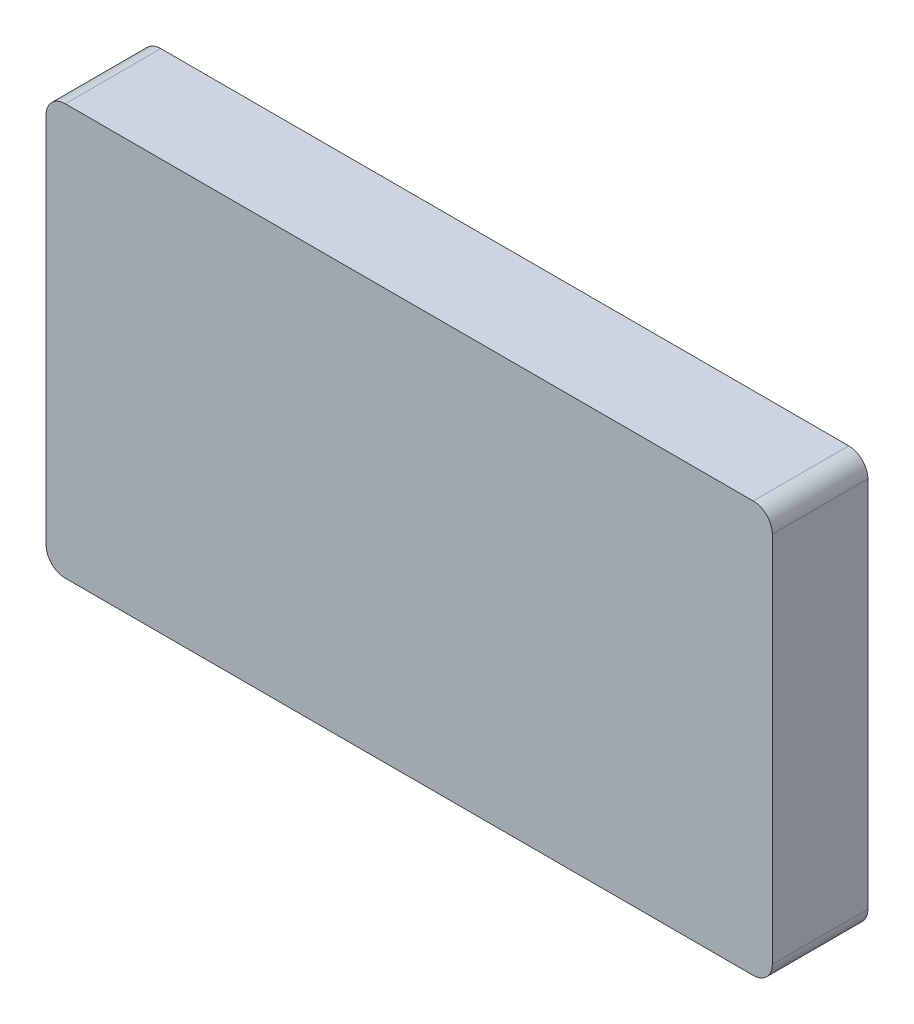
ISO-10303-21;
HEADER;
FILE_DESCRIPTION(('STEP AP214'),'2;1');
FILE_NAME('part.step','',(''),(''),'','','');
FILE_SCHEMA(('AUTOMOTIVE_DESIGN { 1 0 10303 214 1 1 1 1 }'));
ENDSEC;
DATA;
#1=APPLICATION_CONTEXT('core data for automotive mechanical design processes');
#2=APPLICATION_PROTOCOL_DEFINITION('international standard','automotive_design',2000,#1);
#3=PRODUCT_CONTEXT('',#1,'mechanical');
#4=PRODUCT('Part','Part','',(#3));
#5=PRODUCT_RELATED_PRODUCT_CATEGORY('part','',(#4));
#6=PRODUCT_DEFINITION_FORMATION('','',#4);
#7=PRODUCT_DEFINITION_CONTEXT('part definition',#1,'design');
#8=PRODUCT_DEFINITION('design','',#6,#7);
#9=PRODUCT_DEFINITION_SHAPE('','',#8);
#10=(LENGTH_UNIT() NAMED_UNIT(*) SI_UNIT(.MILLI.,.METRE.));
#11=(NAMED_UNIT(*) PLANE_ANGLE_UNIT() SI_UNIT($,.RADIAN.));
#12=(NAMED_UNIT(*) SI_UNIT($,.STERADIAN.) SOLID_ANGLE_UNIT());
#13=UNCERTAINTY_MEASURE_WITH_UNIT(LENGTH_MEASURE(1.E-05),#10,'distance_accuracy_value','');
#14=(GEOMETRIC_REPRESENTATION_CONTEXT(3) GLOBAL_UNCERTAINTY_ASSIGNED_CONTEXT((#13)) GLOBAL_UNIT_ASSIGNED_CONTEXT((#10,
#11,#12)) REPRESENTATION_CONTEXT('',''));
#15=CARTESIAN_POINT('',(0.,0.,0.));
#16=DIRECTION('',(0.,0.,1.));
#17=DIRECTION('',(1.,0.,0.));
#18=AXIS2_PLACEMENT_3D('',#15,#16,#17);
#19=CARTESIAN_POINT('',(170.999999046326,-97.9999992251397,26.9999999552965));
#20=DIRECTION('',(0.,0.,1.));
#21=DIRECTION('',(1.,0.,0.));
#22=AXIS2_PLACEMENT_3D('',#19,#20,#21);
#23=CYLINDRICAL_SURFACE('',#22,10.);
#24=DIRECTION('',(0.,0.,1.));
#25=VECTOR('',#24,1.);
#26=CARTESIAN_POINT('',(170.999999046326,-107.99999922514,26.9999999552965));
#27=LINE('',#26,#25);
#28=CARTESIAN_POINT('',(170.999999046326,-107.99999922514,-23.0000000447035));
#29=VERTEX_POINT('',#28);
#30=CARTESIAN_POINT('',(170.999999046326,-107.99999922514,26.9999999552965));
#31=VERTEX_POINT('',#30);
#32=EDGE_CURVE('E218',#29,#31,#27,.T.);
#33=ORIENTED_EDGE('',*,*,#32,.F.);
#34=CARTESIAN_POINT('',(170.999999046326,-97.9999992251397,-23.0000000447035));
#35=DIRECTION('',(0.,0.,1.));
#36=DIRECTION('',(1.,0.,0.));
#37=AXIS2_PLACEMENT_3D('',#34,#35,#36);
#38=CIRCLE('',#37,10.);
#39=CARTESIAN_POINT('',(180.999999046326,-97.9999992251397,-23.0000000447035));
#40=VERTEX_POINT('',#39);
#41=EDGE_CURVE('E47',#40,#29,#38,.F.);
#42=ORIENTED_EDGE('',*,*,#41,.F.);
#43=DIRECTION('',(0.,0.,1.));
#44=VECTOR('',#43,1.);
#45=CARTESIAN_POINT('',(180.999999046326,-97.9999992251397,26.9999999552965));
#46=LINE('',#45,#44);
#47=CARTESIAN_POINT('',(180.999999046326,-97.9999992251397,26.9999999552965));
#48=VERTEX_POINT('',#47);
#49=EDGE_CURVE('E221',#48,#40,#46,.F.);
#50=ORIENTED_EDGE('',*,*,#49,.F.);
#51=CARTESIAN_POINT('',(170.999999046326,-97.9999992251397,26.9999999552965));
#52=DIRECTION('',(0.,0.,1.));
#53=DIRECTION('',(1.,0.,0.));
#54=AXIS2_PLACEMENT_3D('',#51,#52,#53);
#55=CIRCLE('',#54,10.);
#56=EDGE_CURVE('E12',#31,#48,#55,.T.);
#57=ORIENTED_EDGE('',*,*,#56,.F.);
#58=EDGE_LOOP('',(#33,#42,#50,#57));
#59=FACE_BOUND('',#58,.T.);
#60=ADVANCED_FACE('F40',(#59),#23,.T.);
#61=CARTESIAN_POINT('',(-189.000000953674,-97.9999992251396,26.9999999552965));
#62=DIRECTION('',(0.,0.,1.));
#63=DIRECTION('',(1.,0.,0.));
#64=AXIS2_PLACEMENT_3D('',#61,#62,#63);
#65=CYLINDRICAL_SURFACE('',#64,10.);
#66=DIRECTION('',(0.,0.,1.));
#67=VECTOR('',#66,1.);
#68=CARTESIAN_POINT('',(-199.000000953674,-97.9999992251396,26.9999999552965));
#69=LINE('',#68,#67);
#70=CARTESIAN_POINT('',(-199.000000953674,-97.9999992251396,-23.0000000447035));
#71=VERTEX_POINT('',#70);
#72=CARTESIAN_POINT('',(-199.000000953674,-97.9999992251396,26.9999999552965));
#73=VERTEX_POINT('',#72);
#74=EDGE_CURVE('E207',#71,#73,#69,.T.);
#75=ORIENTED_EDGE('',*,*,#74,.F.);
#76=CARTESIAN_POINT('',(-189.000000953674,-97.9999992251396,-23.0000000447035));
#77=DIRECTION('',(0.,0.,1.));
#78=DIRECTION('',(1.,0.,0.));
#79=AXIS2_PLACEMENT_3D('',#76,#77,#78);
#80=CIRCLE('',#79,10.);
#81=CARTESIAN_POINT('',(-189.000000953674,-107.99999922514,-23.0000000447035));
#82=VERTEX_POINT('',#81);
#83=EDGE_CURVE('E213',#82,#71,#80,.F.);
#84=ORIENTED_EDGE('',*,*,#83,.F.);
#85=DIRECTION('',(0.,0.,1.));
#86=VECTOR('',#85,1.);
#87=CARTESIAN_POINT('',(-189.000000953674,-107.99999922514,26.9999999552965));
#88=LINE('',#87,#86);
#89=CARTESIAN_POINT('',(-189.000000953674,-107.99999922514,26.9999999552965));
#90=VERTEX_POINT('',#89);
#91=EDGE_CURVE('E210',#90,#82,#88,.F.);
#92=ORIENTED_EDGE('',*,*,#91,.F.);
#93=CARTESIAN_POINT('',(-189.000000953674,-97.9999992251396,26.9999999552965));
#94=DIRECTION('',(0.,0.,1.));
#95=DIRECTION('',(1.,0.,0.));
#96=AXIS2_PLACEMENT_3D('',#93,#94,#95);
#97=CIRCLE('',#96,10.);
#98=EDGE_CURVE('E215',#73,#90,#97,.T.);
#99=ORIENTED_EDGE('',*,*,#98,.F.);
#100=EDGE_LOOP('',(#75,#84,#92,#99));
#101=FACE_BOUND('',#100,.T.);
#102=ADVANCED_FACE('F232',(#101),#65,.T.);
#103=CARTESIAN_POINT('',(-189.000000953674,97.0000007748604,26.9999999552965));
#104=DIRECTION('',(0.,0.,1.));
#105=DIRECTION('',(1.,0.,0.));
#106=AXIS2_PLACEMENT_3D('',#103,#104,#105);
#107=CYLINDRICAL_SURFACE('',#106,10.);
#108=DIRECTION('',(0.,0.,1.));
#109=VECTOR('',#108,1.);
#110=CARTESIAN_POINT('',(-189.000000953674,107.00000077486,26.9999999552965));
#111=LINE('',#110,#109);
#112=CARTESIAN_POINT('',(-189.000000953674,107.00000077486,-23.0000000447035));
#113=VERTEX_POINT('',#112);
#114=CARTESIAN_POINT('',(-189.000000953674,107.00000077486,26.9999999552965));
#115=VERTEX_POINT('',#114);
#116=EDGE_CURVE('E196',#113,#115,#111,.T.);
#117=ORIENTED_EDGE('',*,*,#116,.F.);
#118=CARTESIAN_POINT('',(-189.000000953674,97.0000007748604,-23.0000000447035));
#119=DIRECTION('',(0.,0.,1.));
#120=DIRECTION('',(1.,0.,0.));
#121=AXIS2_PLACEMENT_3D('',#118,#119,#120);
#122=CIRCLE('',#121,10.);
#123=CARTESIAN_POINT('',(-199.000000953674,97.0000007748604,-23.0000000447035));
#124=VERTEX_POINT('',#123);
#125=EDGE_CURVE('E202',#124,#113,#122,.F.);
#126=ORIENTED_EDGE('',*,*,#125,.F.);
#127=DIRECTION('',(0.,0.,1.));
#128=VECTOR('',#127,1.);
#129=CARTESIAN_POINT('',(-199.000000953674,97.0000007748604,26.9999999552965));
#130=LINE('',#129,#128);
#131=CARTESIAN_POINT('',(-199.000000953674,97.0000007748604,26.9999999552965));
#132=VERTEX_POINT('',#131);
#133=EDGE_CURVE('E199',#132,#124,#130,.F.);
#134=ORIENTED_EDGE('',*,*,#133,.F.);
#135=CARTESIAN_POINT('',(-189.000000953674,97.0000007748604,26.9999999552965));
#136=DIRECTION('',(0.,0.,1.));
#137=DIRECTION('',(1.,0.,0.));
#138=AXIS2_PLACEMENT_3D('',#135,#136,#137);
#139=CIRCLE('',#138,10.);
#140=EDGE_CURVE('E204',#115,#132,#139,.T.);
#141=ORIENTED_EDGE('',*,*,#140,.F.);
#142=EDGE_LOOP('',(#117,#126,#134,#141));
#143=FACE_BOUND('',#142,.T.);
#144=ADVANCED_FACE('F239',(#143),#107,.T.);
#145=CARTESIAN_POINT('',(170.999999046326,97.0000007748604,26.9999999552965));
#146=DIRECTION('',(0.,0.,1.));
#147=DIRECTION('',(1.,0.,0.));
#148=AXIS2_PLACEMENT_3D('',#145,#146,#147);
#149=CYLINDRICAL_SURFACE('',#148,10.);
#150=DIRECTION('',(0.,0.,1.));
#151=VECTOR('',#150,1.);
#152=CARTESIAN_POINT('',(180.999999046326,97.0000007748604,26.9999999552965));
#153=LINE('',#152,#151);
#154=CARTESIAN_POINT('',(180.999999046326,97.0000007748604,-23.0000000447035));
#155=VERTEX_POINT('',#154);
#156=CARTESIAN_POINT('',(180.999999046326,97.0000007748604,26.9999999552965));
#157=VERTEX_POINT('',#156);
#158=EDGE_CURVE('E178',#155,#157,#153,.T.);
#159=ORIENTED_EDGE('',*,*,#158,.F.);
#160=CARTESIAN_POINT('',(170.999999046326,97.0000007748604,-23.0000000447035));
#161=DIRECTION('',(0.,0.,1.));
#162=DIRECTION('',(1.,0.,0.));
#163=AXIS2_PLACEMENT_3D('',#160,#161,#162);
#164=CIRCLE('',#163,10.);
#165=CARTESIAN_POINT('',(170.999999046326,107.00000077486,-23.0000000447035));
#166=VERTEX_POINT('',#165);
#167=EDGE_CURVE('E191',#166,#155,#164,.F.);
#168=ORIENTED_EDGE('',*,*,#167,.F.);
#169=DIRECTION('',(0.,0.,1.));
#170=VECTOR('',#169,1.);
#171=CARTESIAN_POINT('',(170.999999046326,107.00000077486,26.9999999552965));
#172=LINE('',#171,#170);
#173=CARTESIAN_POINT('',(170.999999046326,107.00000077486,26.9999999552965));
#174=VERTEX_POINT('',#173);
#175=EDGE_CURVE('E188',#174,#166,#172,.F.);
#176=ORIENTED_EDGE('',*,*,#175,.F.);
#177=CARTESIAN_POINT('',(170.999999046326,97.0000007748604,26.9999999552965));
#178=DIRECTION('',(0.,0.,1.));
#179=DIRECTION('',(1.,0.,0.));
#180=AXIS2_PLACEMENT_3D('',#177,#178,#179);
#181=CIRCLE('',#180,10.);
#182=EDGE_CURVE('E193',#157,#174,#181,.T.);
#183=ORIENTED_EDGE('',*,*,#182,.F.);
#184=EDGE_LOOP('',(#159,#168,#176,#183));
#185=FACE_BOUND('',#184,.T.);
#186=ADVANCED_FACE('F251',(#185),#149,.T.);
#187=CARTESIAN_POINT('',(-199.000000953674,107.00000077486,26.9999999552965));
#188=DIRECTION('',(-1.,0.,0.));
#189=DIRECTION('',(0.,0.,1.));
#190=AXIS2_PLACEMENT_3D('',#187,#188,#189);
#191=PLANE('',#190);
#192=DIRECTION('',(0.,1.,0.));
#193=VECTOR('',#192,1.);
#194=CARTESIAN_POINT('',(-199.000000953674,107.00000077486,-23.0000000447035));
#195=LINE('',#194,#193);
#196=EDGE_CURVE('E167',#71,#124,#195,.T.);
#197=ORIENTED_EDGE('',*,*,#196,.F.);
#198=ORIENTED_EDGE('',*,*,#74,.T.);
#199=DIRECTION('',(0.,1.,0.));
#200=VECTOR('',#199,1.);
#201=CARTESIAN_POINT('',(-199.000000953674,107.00000077486,26.9999999552965));
#202=LINE('',#201,#200);
#203=EDGE_CURVE('E168',#73,#132,#202,.T.);
#204=ORIENTED_EDGE('',*,*,#203,.T.);
#205=ORIENTED_EDGE('',*,*,#133,.T.);
#206=EDGE_LOOP('',(#197,#198,#204,#205));
#207=FACE_BOUND('',#206,.T.);
#208=ADVANCED_FACE('F241',(#207),#191,.T.);
#209=CARTESIAN_POINT('',(-199.000000953674,-107.99999922514,26.9999999552965));
#210=DIRECTION('',(0.,-1.,0.));
#211=DIRECTION('',(1.,0.,0.));
#212=AXIS2_PLACEMENT_3D('',#209,#210,#211);
#213=PLANE('',#212);
#214=DIRECTION('',(-1.,0.,0.));
#215=VECTOR('',#214,1.);
#216=CARTESIAN_POINT('',(-199.000000953674,-107.99999922514,-23.0000000447035));
#217=LINE('',#216,#215);
#218=EDGE_CURVE('E171',#29,#82,#217,.T.);
#219=ORIENTED_EDGE('',*,*,#218,.F.);
#220=ORIENTED_EDGE('',*,*,#32,.T.);
#221=DIRECTION('',(-1.,0.,0.));
#222=VECTOR('',#221,1.);
#223=CARTESIAN_POINT('',(-199.000000953674,-107.99999922514,26.9999999552965));
#224=LINE('',#223,#222);
#225=EDGE_CURVE('E176',#31,#90,#224,.T.);
#226=ORIENTED_EDGE('',*,*,#225,.T.);
#227=ORIENTED_EDGE('',*,*,#91,.T.);
#228=EDGE_LOOP('',(#219,#220,#226,#227));
#229=FACE_BOUND('',#228,.T.);
#230=ADVANCED_FACE('F228',(#229),#213,.T.);
#231=CARTESIAN_POINT('',(180.999999046326,107.00000077486,26.9999999552965));
#232=DIRECTION('',(1.,0.,0.));
#233=DIRECTION('',(0.,1.,0.));
#234=AXIS2_PLACEMENT_3D('',#231,#232,#233);
#235=PLANE('',#234);
#236=DIRECTION('',(0.,-1.,0.));
#237=VECTOR('',#236,1.);
#238=CARTESIAN_POINT('',(180.999999046326,107.00000077486,26.9999999552965));
#239=LINE('',#238,#237);
#240=EDGE_CURVE('E173',#157,#48,#239,.T.);
#241=ORIENTED_EDGE('',*,*,#240,.T.);
#242=ORIENTED_EDGE('',*,*,#49,.T.);
#243=DIRECTION('',(0.,-1.,0.));
#244=VECTOR('',#243,1.);
#245=CARTESIAN_POINT('',(180.999999046326,107.00000077486,-23.0000000447035));
#246=LINE('',#245,#244);
#247=EDGE_CURVE('E182',#155,#40,#246,.T.);
#248=ORIENTED_EDGE('',*,*,#247,.F.);
#249=ORIENTED_EDGE('',*,*,#158,.T.);
#250=EDGE_LOOP('',(#241,#242,#248,#249));
#251=FACE_BOUND('',#250,.T.);
#252=ADVANCED_FACE('F253',(#251),#235,.T.);
#253=CARTESIAN_POINT('',(-199.000000953674,107.00000077486,26.9999999552965));
#254=DIRECTION('',(0.,1.,0.));
#255=DIRECTION('',(-1.,0.,0.));
#256=AXIS2_PLACEMENT_3D('',#253,#254,#255);
#257=PLANE('',#256);
#258=DIRECTION('',(1.,0.,0.));
#259=VECTOR('',#258,1.);
#260=CARTESIAN_POINT('',(-199.000000953674,107.00000077486,-23.0000000447035));
#261=LINE('',#260,#259);
#262=EDGE_CURVE('E180',#113,#166,#261,.T.);
#263=ORIENTED_EDGE('',*,*,#262,.F.);
#264=ORIENTED_EDGE('',*,*,#116,.T.);
#265=DIRECTION('',(1.,0.,0.));
#266=VECTOR('',#265,1.);
#267=CARTESIAN_POINT('',(-199.000000953674,107.00000077486,26.9999999552965));
#268=LINE('',#267,#266);
#269=EDGE_CURVE('E170',#115,#174,#268,.T.);
#270=ORIENTED_EDGE('',*,*,#269,.T.);
#271=ORIENTED_EDGE('',*,*,#175,.T.);
#272=EDGE_LOOP('',(#263,#264,#270,#271));
#273=FACE_BOUND('',#272,.T.);
#274=ADVANCED_FACE('F246',(#273),#257,.T.);
#275=CARTESIAN_POINT('',(0.,0.,26.9999999552965));
#276=DIRECTION('',(0.,0.,1.));
#277=DIRECTION('',(1.,0.,0.));
#278=AXIS2_PLACEMENT_3D('',#275,#276,#277);
#279=PLANE('',#278);
#280=ORIENTED_EDGE('',*,*,#225,.F.);
#281=ORIENTED_EDGE('',*,*,#56,.T.);
#282=ORIENTED_EDGE('',*,*,#240,.F.);
#283=ORIENTED_EDGE('',*,*,#182,.T.);
#284=ORIENTED_EDGE('',*,*,#269,.F.);
#285=ORIENTED_EDGE('',*,*,#140,.T.);
#286=ORIENTED_EDGE('',*,*,#203,.F.);
#287=ORIENTED_EDGE('',*,*,#98,.T.);
#288=EDGE_LOOP('',(#280,#281,#282,#283,#284,#285,#286,#287));
#289=FACE_BOUND('',#288,.T.);
#290=ADVANCED_FACE('F244',(#289),#279,.T.);
#291=CARTESIAN_POINT('',(0.,0.,-23.0000000447035));
#292=DIRECTION('',(0.,0.,1.));
#293=DIRECTION('',(1.,0.,0.));
#294=AXIS2_PLACEMENT_3D('',#291,#292,#293);
#295=PLANE('',#294);
#296=ORIENTED_EDGE('',*,*,#247,.T.);
#297=ORIENTED_EDGE('',*,*,#41,.T.);
#298=ORIENTED_EDGE('',*,*,#218,.T.);
#299=ORIENTED_EDGE('',*,*,#83,.T.);
#300=ORIENTED_EDGE('',*,*,#196,.T.);
#301=ORIENTED_EDGE('',*,*,#125,.T.);
#302=ORIENTED_EDGE('',*,*,#262,.T.);
#303=ORIENTED_EDGE('',*,*,#167,.T.);
#304=EDGE_LOOP('',(#296,#297,#298,#299,#300,#301,#302,#303));
#305=FACE_BOUND('',#304,.T.);
#306=ADVANCED_FACE('F223',(#305),#295,.F.);
#307=CLOSED_SHELL('',(#60,#102,#144,#186,#208,#230,#252,#274,#290,#306));
#308=CARTESIAN_POINT('',(175.999999046326,102.00000077486,-445.995271885891));
#309=DIRECTION('',(1.,0.,0.));
#310=DIRECTION('',(0.,1.,0.));
#311=AXIS2_PLACEMENT_3D('',#308,#309,#310);
#312=PLANE('',#311);
#313=DIRECTION('',(0.,-1.,0.));
#314=VECTOR('',#313,1.);
#315=CARTESIAN_POINT('',(175.999999046326,102.00000077486,-18.0000000447035));
#316=LINE('',#315,#314);
#317=CARTESIAN_POINT('',(175.999999046326,102.00000077486,-18.0000000447035));
#318=VERTEX_POINT('',#317);
#319=CARTESIAN_POINT('',(175.999999046326,-102.99999922514,-18.0000000447035));
#320=VERTEX_POINT('',#319);
#321=EDGE_CURVE('E161',#318,#320,#316,.T.);
#322=ORIENTED_EDGE('',*,*,#321,.T.);
#323=DIRECTION('',(0.,0.,1.));
#324=VECTOR('',#323,1.);
#325=CARTESIAN_POINT('',(175.999999046326,-102.99999922514,-445.995271885891));
#326=LINE('',#325,#324);
#327=CARTESIAN_POINT('',(175.999999046326,-102.99999922514,21.9999999552965));
#328=VERTEX_POINT('',#327);
#329=EDGE_CURVE('E136',#320,#328,#326,.T.);
#330=ORIENTED_EDGE('',*,*,#329,.T.);
#331=DIRECTION('',(0.,1.,0.));
#332=VECTOR('',#331,1.);
#333=CARTESIAN_POINT('',(175.999999046326,102.00000077486,21.9999999552965));
#334=LINE('',#333,#332);
#335=CARTESIAN_POINT('',(175.999999046326,102.00000077486,21.9999999552966));
#336=VERTEX_POINT('',#335);
#337=EDGE_CURVE('E147',#328,#336,#334,.T.);
#338=ORIENTED_EDGE('',*,*,#337,.T.);
#339=DIRECTION('',(0.,0.,1.));
#340=VECTOR('',#339,1.);
#341=CARTESIAN_POINT('',(175.999999046326,102.00000077486,-445.995271885891));
#342=LINE('',#341,#340);
#343=EDGE_CURVE('E151',#318,#336,#342,.T.);
#344=ORIENTED_EDGE('',*,*,#343,.F.);
#345=EDGE_LOOP('',(#322,#330,#338,#344));
#346=FACE_BOUND('',#345,.T.);
#347=ADVANCED_FACE('F312',(#346),#312,.F.);
#348=CARTESIAN_POINT('',(175.999999046326,-102.99999922514,-445.995271885891));
#349=DIRECTION('',(0.,-1.,0.));
#350=DIRECTION('',(1.,0.,0.));
#351=AXIS2_PLACEMENT_3D('',#348,#349,#350);
#352=PLANE('',#351);
#353=DIRECTION('',(-1.,0.,0.));
#354=VECTOR('',#353,1.);
#355=CARTESIAN_POINT('',(175.999999046326,-102.99999922514,-18.0000000447035));
#356=LINE('',#355,#354);
#357=CARTESIAN_POINT('',(-194.000000953674,-102.99999922514,-18.0000000447035));
#358=VERTEX_POINT('',#357);
#359=EDGE_CURVE('E132',#320,#358,#356,.T.);
#360=ORIENTED_EDGE('',*,*,#359,.T.);
#361=DIRECTION('',(0.,0.,1.));
#362=VECTOR('',#361,1.);
#363=CARTESIAN_POINT('',(-194.000000953674,-102.99999922514,-445.995271885891));
#364=LINE('',#363,#362);
#365=CARTESIAN_POINT('',(-194.000000953674,-102.99999922514,21.9999999552966));
#366=VERTEX_POINT('',#365);
#367=EDGE_CURVE('E126',#358,#366,#364,.T.);
#368=ORIENTED_EDGE('',*,*,#367,.T.);
#369=DIRECTION('',(1.,0.,0.));
#370=VECTOR('',#369,1.);
#371=CARTESIAN_POINT('',(175.999999046326,-102.99999922514,21.9999999552965));
#372=LINE('',#371,#370);
#373=EDGE_CURVE('E130',#366,#328,#372,.T.);
#374=ORIENTED_EDGE('',*,*,#373,.T.);
#375=ORIENTED_EDGE('',*,*,#329,.F.);
#376=EDGE_LOOP('',(#360,#368,#374,#375));
#377=FACE_BOUND('',#376,.T.);
#378=ADVANCED_FACE('F128',(#377),#352,.F.);
#379=CARTESIAN_POINT('',(-194.000000953674,102.00000077486,-445.995271885891));
#380=DIRECTION('',(-1.,0.,0.));
#381=DIRECTION('',(0.,-1.,0.));
#382=AXIS2_PLACEMENT_3D('',#379,#380,#381);
#383=PLANE('',#382);
#384=DIRECTION('',(0.,1.,0.));
#385=VECTOR('',#384,1.);
#386=CARTESIAN_POINT('',(-194.000000953674,102.00000077486,-18.0000000447035));
#387=LINE('',#386,#385);
#388=CARTESIAN_POINT('',(-194.000000953674,102.00000077486,-18.0000000447035));
#389=VERTEX_POINT('',#388);
#390=EDGE_CURVE('E158',#358,#389,#387,.T.);
#391=ORIENTED_EDGE('',*,*,#390,.T.);
#392=DIRECTION('',(0.,0.,1.));
#393=VECTOR('',#392,1.);
#394=CARTESIAN_POINT('',(-194.000000953674,102.00000077486,-445.995271885891));
#395=LINE('',#394,#393);
#396=CARTESIAN_POINT('',(-194.000000953674,102.00000077486,21.9999999552966));
#397=VERTEX_POINT('',#396);
#398=EDGE_CURVE('E137',#389,#397,#395,.T.);
#399=ORIENTED_EDGE('',*,*,#398,.T.);
#400=DIRECTION('',(0.,-1.,0.));
#401=VECTOR('',#400,1.);
#402=CARTESIAN_POINT('',(-194.000000953674,102.00000077486,21.9999999552965));
#403=LINE('',#402,#401);
#404=EDGE_CURVE('E144',#397,#366,#403,.T.);
#405=ORIENTED_EDGE('',*,*,#404,.T.);
#406=ORIENTED_EDGE('',*,*,#367,.F.);
#407=EDGE_LOOP('',(#391,#399,#405,#406));
#408=FACE_BOUND('',#407,.T.);
#409=ADVANCED_FACE('F149',(#408),#383,.F.);
#410=CARTESIAN_POINT('',(175.999999046326,102.00000077486,-445.995271885891));
#411=DIRECTION('',(0.,1.,0.));
#412=DIRECTION('',(-1.,0.,0.));
#413=AXIS2_PLACEMENT_3D('',#410,#411,#412);
#414=PLANE('',#413);
#415=DIRECTION('',(1.,0.,0.));
#416=VECTOR('',#415,1.);
#417=CARTESIAN_POINT('',(175.999999046326,102.00000077486,-18.0000000447035));
#418=LINE('',#417,#416);
#419=EDGE_CURVE('E163',#389,#318,#418,.T.);
#420=ORIENTED_EDGE('',*,*,#419,.T.);
#421=ORIENTED_EDGE('',*,*,#343,.T.);
#422=DIRECTION('',(-1.,0.,0.));
#423=VECTOR('',#422,1.);
#424=CARTESIAN_POINT('',(175.999999046326,102.00000077486,21.9999999552965));
#425=LINE('',#424,#423);
#426=EDGE_CURVE('E152',#336,#397,#425,.T.);
#427=ORIENTED_EDGE('',*,*,#426,.T.);
#428=ORIENTED_EDGE('',*,*,#398,.F.);
#429=EDGE_LOOP('',(#420,#421,#427,#428));
#430=FACE_BOUND('',#429,.T.);
#431=ADVANCED_FACE('F334',(#430),#414,.F.);
#432=CARTESIAN_POINT('',(0.,0.,-18.0000000447035));
#433=DIRECTION('',(0.,0.,1.));
#434=DIRECTION('',(1.,0.,0.));
#435=AXIS2_PLACEMENT_3D('',#432,#433,#434);
#436=PLANE('',#435);
#437=ORIENTED_EDGE('',*,*,#321,.F.);
#438=ORIENTED_EDGE('',*,*,#419,.F.);
#439=ORIENTED_EDGE('',*,*,#390,.F.);
#440=ORIENTED_EDGE('',*,*,#359,.F.);
#441=EDGE_LOOP('',(#437,#438,#439,#440));
#442=FACE_BOUND('',#441,.T.);
#443=ADVANCED_FACE('F343',(#442),#436,.T.);
#444=CARTESIAN_POINT('',(0.,0.,21.9999999552965));
#445=DIRECTION('',(0.,0.,1.));
#446=DIRECTION('',(1.,0.,0.));
#447=AXIS2_PLACEMENT_3D('',#444,#445,#446);
#448=PLANE('',#447);
#449=ORIENTED_EDGE('',*,*,#373,.F.);
#450=ORIENTED_EDGE('',*,*,#404,.F.);
#451=ORIENTED_EDGE('',*,*,#426,.F.);
#452=ORIENTED_EDGE('',*,*,#337,.F.);
#453=EDGE_LOOP('',(#449,#450,#451,#452));
#454=FACE_BOUND('',#453,.T.);
#455=ADVANCED_FACE('F142',(#454),#448,.F.);
#456=CLOSED_SHELL('',(#347,#378,#409,#431,#443,#455));
#457=ORIENTED_CLOSED_SHELL('',*,#456,.T.);
#458=BREP_WITH_VOIDS('B2',#307,(#457));
#459=ADVANCED_BREP_SHAPE_REPRESENTATION('',(#18,#458),#14);
#460=SHAPE_DEFINITION_REPRESENTATION(#9,#459);
ENDSEC;
END-ISO-10303-21;
